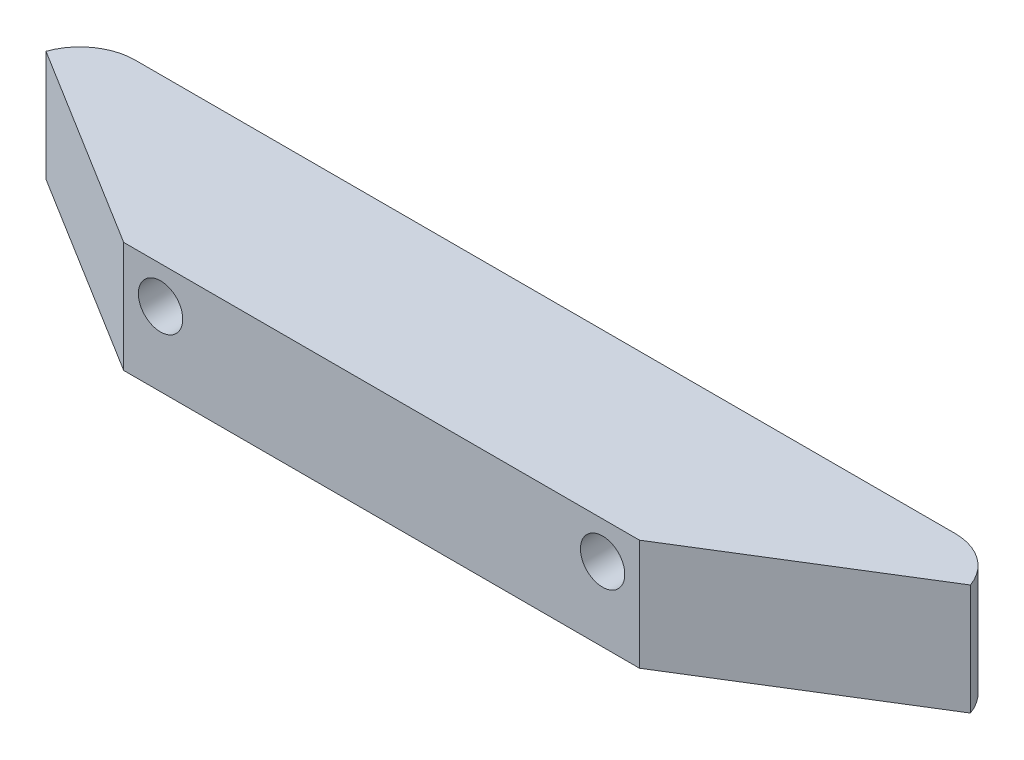
ISO-10303-21;
HEADER;
FILE_DESCRIPTION(('STEP AP214'),'2;1');
FILE_NAME('part.step','',(''),(''),'','','');
FILE_SCHEMA(('AUTOMOTIVE_DESIGN { 1 0 10303 214 1 1 1 1 }'));
ENDSEC;
DATA;
#1=APPLICATION_CONTEXT('core data for automotive mechanical design processes');
#2=APPLICATION_PROTOCOL_DEFINITION('international standard','automotive_design',2000,#1);
#3=PRODUCT_CONTEXT('',#1,'mechanical');
#4=PRODUCT('Part','Part','',(#3));
#5=PRODUCT_RELATED_PRODUCT_CATEGORY('part','',(#4));
#6=PRODUCT_DEFINITION_FORMATION('','',#4);
#7=PRODUCT_DEFINITION_CONTEXT('part definition',#1,'design');
#8=PRODUCT_DEFINITION('design','',#6,#7);
#9=PRODUCT_DEFINITION_SHAPE('','',#8);
#10=(LENGTH_UNIT() NAMED_UNIT(*) SI_UNIT(.MILLI.,.METRE.));
#11=(NAMED_UNIT(*) PLANE_ANGLE_UNIT() SI_UNIT($,.RADIAN.));
#12=(NAMED_UNIT(*) SI_UNIT($,.STERADIAN.) SOLID_ANGLE_UNIT());
#13=UNCERTAINTY_MEASURE_WITH_UNIT(LENGTH_MEASURE(1.E-05),#10,'distance_accuracy_value','');
#14=(GEOMETRIC_REPRESENTATION_CONTEXT(3) GLOBAL_UNCERTAINTY_ASSIGNED_CONTEXT((#13)) GLOBAL_UNIT_ASSIGNED_CONTEXT((#10,
#11,#12)) REPRESENTATION_CONTEXT('',''));
#15=CARTESIAN_POINT('',(0.,0.,0.));
#16=DIRECTION('',(0.,0.,1.));
#17=DIRECTION('',(1.,0.,0.));
#18=AXIS2_PLACEMENT_3D('',#15,#16,#17);
#19=CARTESIAN_POINT('',(-50.,12.,-13.7));
#20=DIRECTION('',(0.526798006466688,0.,-0.849990506054463));
#21=DIRECTION('',(-0.849990506054464,0.,-0.526798006466688));
#22=AXIS2_PLACEMENT_3D('',#19,#20,#21);
#23=PLANE('',#22);
#24=DIRECTION('',(0.849990506054463,0.,0.526798006466688));
#25=VECTOR('',#24,1.);
#26=CARTESIAN_POINT('',(-50.,0.,-13.7));
#27=LINE('',#26,#25);
#28=CARTESIAN_POINT('',(-50.,0.,-13.7));
#29=VERTEX_POINT('',#28);
#30=CARTESIAN_POINT('',(-27.895,0.,0.));
#31=VERTEX_POINT('',#30);
#32=EDGE_CURVE('E138',#29,#31,#27,.T.);
#33=ORIENTED_EDGE('',*,*,#32,.T.);
#34=DIRECTION('',(0.,-1.,0.));
#35=VECTOR('',#34,1.);
#36=CARTESIAN_POINT('',(-27.895,12.,0.));
#37=LINE('',#36,#35);
#38=CARTESIAN_POINT('',(-27.895,12.,0.));
#39=VERTEX_POINT('',#38);
#40=EDGE_CURVE('E95',#39,#31,#37,.T.);
#41=ORIENTED_EDGE('',*,*,#40,.F.);
#42=DIRECTION('',(0.849990506054463,0.,0.526798006466688));
#43=VECTOR('',#42,1.);
#44=CARTESIAN_POINT('',(-50.,12.,-13.7));
#45=LINE('',#44,#43);
#46=CARTESIAN_POINT('',(-50.,12.,-13.7));
#47=VERTEX_POINT('',#46);
#48=EDGE_CURVE('E85',#47,#39,#45,.T.);
#49=ORIENTED_EDGE('',*,*,#48,.F.);
#50=DIRECTION('',(0.,-1.,0.));
#51=VECTOR('',#50,1.);
#52=CARTESIAN_POINT('',(-50.,12.,-13.7));
#53=LINE('',#52,#51);
#54=EDGE_CURVE('E93',#47,#29,#53,.T.);
#55=ORIENTED_EDGE('',*,*,#54,.T.);
#56=EDGE_LOOP('',(#33,#41,#49,#55));
#57=FACE_BOUND('',#56,.T.);
#58=ADVANCED_FACE('F33',(#57),#23,.F.);
#59=CARTESIAN_POINT('',(-27.895,12.,0.));
#60=DIRECTION('',(0.,0.,-1.));
#61=DIRECTION('',(-1.,0.,0.));
#62=AXIS2_PLACEMENT_3D('',#59,#60,#61);
#63=PLANE('',#62);
#64=CARTESIAN_POINT('',(-23.91,7.99999999999999,0.));
#65=DIRECTION('',(0.,0.,1.));
#66=DIRECTION('',(1.,0.,0.));
#67=AXIS2_PLACEMENT_3D('',#64,#65,#66);
#68=CIRCLE('',#67,2.4);
#69=CARTESIAN_POINT('',(-21.51,7.99999999999999,0.));
#70=VERTEX_POINT('',#69);
#71=EDGE_CURVE('E149',#70,#70,#68,.T.);
#72=ORIENTED_EDGE('',*,*,#71,.F.);
#73=EDGE_LOOP('',(#72));
#74=FACE_BOUND('',#73,.T.);
#75=CARTESIAN_POINT('',(23.91,7.99999999999999,0.));
#76=DIRECTION('',(0.,0.,1.));
#77=DIRECTION('',(-1.,0.,0.));
#78=AXIS2_PLACEMENT_3D('',#75,#76,#77);
#79=CIRCLE('',#78,2.4);
#80=CARTESIAN_POINT('',(21.51,7.99999999999999,0.));
#81=VERTEX_POINT('',#80);
#82=EDGE_CURVE('E143',#81,#81,#79,.T.);
#83=ORIENTED_EDGE('',*,*,#82,.F.);
#84=EDGE_LOOP('',(#83));
#85=FACE_BOUND('',#84,.T.);
#86=DIRECTION('',(1.,0.,0.));
#87=VECTOR('',#86,1.);
#88=CARTESIAN_POINT('',(-27.895,0.,0.));
#89=LINE('',#88,#87);
#90=CARTESIAN_POINT('',(27.895,0.,0.));
#91=VERTEX_POINT('',#90);
#92=EDGE_CURVE('E129',#31,#91,#89,.T.);
#93=ORIENTED_EDGE('',*,*,#92,.T.);
#94=DIRECTION('',(0.,-1.,0.));
#95=VECTOR('',#94,1.);
#96=CARTESIAN_POINT('',(27.895,12.,0.));
#97=LINE('',#96,#95);
#98=CARTESIAN_POINT('',(27.895,12.,0.));
#99=VERTEX_POINT('',#98);
#100=EDGE_CURVE('E105',#99,#91,#97,.T.);
#101=ORIENTED_EDGE('',*,*,#100,.F.);
#102=DIRECTION('',(1.,0.,0.));
#103=VECTOR('',#102,1.);
#104=CARTESIAN_POINT('',(-27.895,12.,0.));
#105=LINE('',#104,#103);
#106=EDGE_CURVE('E97',#39,#99,#105,.T.);
#107=ORIENTED_EDGE('',*,*,#106,.F.);
#108=ORIENTED_EDGE('',*,*,#40,.T.);
#109=EDGE_LOOP('',(#93,#101,#107,#108));
#110=FACE_BOUND('',#109,.T.);
#111=ADVANCED_FACE('F164',(#74,#85,#110),#63,.F.);
#112=CARTESIAN_POINT('',(27.895,12.,0.));
#113=DIRECTION('',(-0.526798006466689,0.,-0.849990506054463));
#114=DIRECTION('',(-0.849990506054463,0.,0.526798006466689));
#115=AXIS2_PLACEMENT_3D('',#112,#113,#114);
#116=PLANE('',#115);
#117=DIRECTION('',(0.849990506054463,0.,-0.526798006466689));
#118=VECTOR('',#117,1.);
#119=CARTESIAN_POINT('',(27.895,0.,0.));
#120=LINE('',#119,#118);
#121=CARTESIAN_POINT('',(50.,0.,-13.7));
#122=VERTEX_POINT('',#121);
#123=EDGE_CURVE('E118',#91,#122,#120,.T.);
#124=ORIENTED_EDGE('',*,*,#123,.T.);
#125=DIRECTION('',(0.,-1.,0.));
#126=VECTOR('',#125,1.);
#127=CARTESIAN_POINT('',(50.,12.,-13.7));
#128=LINE('',#127,#126);
#129=CARTESIAN_POINT('',(50.,12.,-13.7));
#130=VERTEX_POINT('',#129);
#131=EDGE_CURVE('E127',#130,#122,#128,.T.);
#132=ORIENTED_EDGE('',*,*,#131,.F.);
#133=DIRECTION('',(0.849990506054463,0.,-0.526798006466689));
#134=VECTOR('',#133,1.);
#135=CARTESIAN_POINT('',(27.895,12.,0.));
#136=LINE('',#135,#134);
#137=EDGE_CURVE('E133',#99,#130,#136,.T.);
#138=ORIENTED_EDGE('',*,*,#137,.F.);
#139=ORIENTED_EDGE('',*,*,#100,.T.);
#140=EDGE_LOOP('',(#124,#132,#138,#139));
#141=FACE_BOUND('',#140,.T.);
#142=ADVANCED_FACE('F125',(#141),#116,.F.);
#143=CARTESIAN_POINT('',(-50.,12.,-17.7));
#144=DIRECTION('',(0.,0.,1.));
#145=DIRECTION('',(1.,0.,0.));
#146=AXIS2_PLACEMENT_3D('',#143,#144,#145);
#147=PLANE('',#146);
#148=DIRECTION('',(-1.,0.,0.));
#149=VECTOR('',#148,1.);
#150=CARTESIAN_POINT('',(-50.,12.,-17.7));
#151=LINE('',#150,#149);
#152=CARTESIAN_POINT('',(44.3431457505076,12.,-17.7));
#153=VERTEX_POINT('',#152);
#154=CARTESIAN_POINT('',(-44.3431457505076,12.,-17.7));
#155=VERTEX_POINT('',#154);
#156=EDGE_CURVE('E87',#153,#155,#151,.T.);
#157=ORIENTED_EDGE('',*,*,#156,.F.);
#158=DIRECTION('',(0.,-1.,0.));
#159=VECTOR('',#158,1.);
#160=CARTESIAN_POINT('',(44.3431457505076,12.,-17.7));
#161=LINE('',#160,#159);
#162=CARTESIAN_POINT('',(44.3431457505076,0.,-17.7));
#163=VERTEX_POINT('',#162);
#164=EDGE_CURVE('E103',#153,#163,#161,.T.);
#165=ORIENTED_EDGE('',*,*,#164,.T.);
#166=DIRECTION('',(-1.,0.,0.));
#167=VECTOR('',#166,1.);
#168=CARTESIAN_POINT('',(-50.,0.,-17.7));
#169=LINE('',#168,#167);
#170=CARTESIAN_POINT('',(-44.3431457505076,0.,-17.7));
#171=VERTEX_POINT('',#170);
#172=EDGE_CURVE('E98',#163,#171,#169,.T.);
#173=ORIENTED_EDGE('',*,*,#172,.T.);
#174=DIRECTION('',(0.,1.,0.));
#175=VECTOR('',#174,1.);
#176=CARTESIAN_POINT('',(-44.3431457505076,12.,-17.7));
#177=LINE('',#176,#175);
#178=EDGE_CURVE('E48',#171,#155,#177,.T.);
#179=ORIENTED_EDGE('',*,*,#178,.T.);
#180=EDGE_LOOP('',(#157,#165,#173,#179));
#181=FACE_BOUND('',#180,.T.);
#182=ADVANCED_FACE('F170',(#181),#147,.F.);
#183=CARTESIAN_POINT('',(0.,12.,0.));
#184=DIRECTION('',(0.,1.,0.));
#185=DIRECTION('',(0.,0.,1.));
#186=AXIS2_PLACEMENT_3D('',#183,#184,#185);
#187=PLANE('',#186);
#188=ORIENTED_EDGE('',*,*,#137,.T.);
#189=CARTESIAN_POINT('',(44.3431457505076,12.,-11.7));
#190=DIRECTION('',(0.,1.,0.));
#191=DIRECTION('',(0.,0.,1.));
#192=AXIS2_PLACEMENT_3D('',#189,#190,#191);
#193=CIRCLE('',#192,6.);
#194=EDGE_CURVE('E11',#130,#153,#193,.T.);
#195=ORIENTED_EDGE('',*,*,#194,.T.);
#196=ORIENTED_EDGE('',*,*,#156,.T.);
#197=CARTESIAN_POINT('',(-44.3431457505076,12.,-11.7));
#198=DIRECTION('',(0.,1.,0.));
#199=DIRECTION('',(0.,0.,1.));
#200=AXIS2_PLACEMENT_3D('',#197,#198,#199);
#201=CIRCLE('',#200,6.);
#202=EDGE_CURVE('E41',#155,#47,#201,.T.);
#203=ORIENTED_EDGE('',*,*,#202,.T.);
#204=ORIENTED_EDGE('',*,*,#48,.T.);
#205=ORIENTED_EDGE('',*,*,#106,.T.);
#206=EDGE_LOOP('',(#188,#195,#196,#203,#204,#205));
#207=FACE_BOUND('',#206,.T.);
#208=ADVANCED_FACE('F84',(#207),#187,.T.);
#209=CARTESIAN_POINT('',(0.,0.,0.));
#210=DIRECTION('',(0.,1.,0.));
#211=DIRECTION('',(0.,0.,1.));
#212=AXIS2_PLACEMENT_3D('',#209,#210,#211);
#213=PLANE('',#212);
#214=ORIENTED_EDGE('',*,*,#172,.F.);
#215=CARTESIAN_POINT('',(44.3431457505076,0.,-11.7));
#216=DIRECTION('',(0.,1.,0.));
#217=DIRECTION('',(0.,0.,1.));
#218=AXIS2_PLACEMENT_3D('',#215,#216,#217);
#219=CIRCLE('',#218,6.);
#220=EDGE_CURVE('E90',#163,#122,#219,.F.);
#221=ORIENTED_EDGE('',*,*,#220,.T.);
#222=ORIENTED_EDGE('',*,*,#123,.F.);
#223=ORIENTED_EDGE('',*,*,#92,.F.);
#224=ORIENTED_EDGE('',*,*,#32,.F.);
#225=CARTESIAN_POINT('',(-44.3431457505076,0.,-11.7));
#226=DIRECTION('',(0.,1.,0.));
#227=DIRECTION('',(0.,0.,1.));
#228=AXIS2_PLACEMENT_3D('',#225,#226,#227);
#229=CIRCLE('',#228,6.);
#230=EDGE_CURVE('E100',#29,#171,#229,.F.);
#231=ORIENTED_EDGE('',*,*,#230,.T.);
#232=EDGE_LOOP('',(#214,#221,#222,#223,#224,#231));
#233=FACE_BOUND('',#232,.T.);
#234=ADVANCED_FACE('F116',(#233),#213,.F.);
#235=CARTESIAN_POINT('',(23.91,7.99999999999999,-8.5));
#236=DIRECTION('',(0.,0.,1.));
#237=DIRECTION('',(1.,0.,0.));
#238=AXIS2_PLACEMENT_3D('',#235,#236,#237);
#239=CYLINDRICAL_SURFACE('',#238,2.4);
#240=CARTESIAN_POINT('',(23.91,7.99999999999999,-8.5));
#241=DIRECTION('',(0.,0.,1.));
#242=DIRECTION('',(-1.,0.,0.));
#243=AXIS2_PLACEMENT_3D('',#240,#241,#242);
#244=CIRCLE('',#243,2.4);
#245=CARTESIAN_POINT('',(21.51,7.99999999999999,-8.5));
#246=VERTEX_POINT('',#245);
#247=EDGE_CURVE('E146',#246,#246,#244,.T.);
#248=ORIENTED_EDGE('',*,*,#247,.F.);
#249=EDGE_LOOP('',(#248));
#250=FACE_BOUND('',#249,.T.);
#251=ORIENTED_EDGE('',*,*,#82,.T.);
#252=EDGE_LOOP('',(#251));
#253=FACE_BOUND('',#252,.T.);
#254=ADVANCED_FACE('F195',(#250,#253),#239,.F.);
#255=CARTESIAN_POINT('',(23.91,7.99999999999999,-8.5));
#256=DIRECTION('',(0.,0.,-1.));
#257=DIRECTION('',(-1.,0.,0.));
#258=AXIS2_PLACEMENT_3D('',#255,#256,#257);
#259=PLANE('',#258);
#260=ORIENTED_EDGE('',*,*,#247,.T.);
#261=EDGE_LOOP('',(#260));
#262=FACE_BOUND('',#261,.T.);
#263=ADVANCED_FACE('F160',(#262),#259,.F.);
#264=CARTESIAN_POINT('',(-23.91,7.99999999999999,-8.5));
#265=DIRECTION('',(0.,0.,1.));
#266=DIRECTION('',(1.,0.,0.));
#267=AXIS2_PLACEMENT_3D('',#264,#265,#266);
#268=CYLINDRICAL_SURFACE('',#267,2.4);
#269=CARTESIAN_POINT('',(-23.91,7.99999999999999,-8.5));
#270=DIRECTION('',(0.,0.,1.));
#271=DIRECTION('',(1.,0.,0.));
#272=AXIS2_PLACEMENT_3D('',#269,#270,#271);
#273=CIRCLE('',#272,2.4);
#274=CARTESIAN_POINT('',(-21.51,7.99999999999999,-8.5));
#275=VERTEX_POINT('',#274);
#276=EDGE_CURVE('E139',#275,#275,#273,.T.);
#277=ORIENTED_EDGE('',*,*,#276,.F.);
#278=EDGE_LOOP('',(#277));
#279=FACE_BOUND('',#278,.T.);
#280=ORIENTED_EDGE('',*,*,#71,.T.);
#281=EDGE_LOOP('',(#280));
#282=FACE_BOUND('',#281,.T.);
#283=ADVANCED_FACE('F157',(#279,#282),#268,.F.);
#284=CARTESIAN_POINT('',(-23.91,7.99999999999999,-8.5));
#285=DIRECTION('',(0.,0.,1.));
#286=DIRECTION('',(1.,0.,0.));
#287=AXIS2_PLACEMENT_3D('',#284,#285,#286);
#288=PLANE('',#287);
#289=ORIENTED_EDGE('',*,*,#276,.T.);
#290=EDGE_LOOP('',(#289));
#291=FACE_BOUND('',#290,.T.);
#292=ADVANCED_FACE('F155',(#291),#288,.T.);
#293=CARTESIAN_POINT('',(44.3431457505076,12.,-11.7));
#294=DIRECTION('',(0.,-1.,0.));
#295=DIRECTION('',(0.,0.,-1.));
#296=AXIS2_PLACEMENT_3D('',#293,#294,#295);
#297=CYLINDRICAL_SURFACE('',#296,6.);
#298=ORIENTED_EDGE('',*,*,#194,.F.);
#299=ORIENTED_EDGE('',*,*,#131,.T.);
#300=ORIENTED_EDGE('',*,*,#220,.F.);
#301=ORIENTED_EDGE('',*,*,#164,.F.);
#302=EDGE_LOOP('',(#298,#299,#300,#301));
#303=FACE_BOUND('',#302,.T.);
#304=ADVANCED_FACE('F131',(#303),#297,.T.);
#305=CARTESIAN_POINT('',(-44.3431457505076,12.,-11.7));
#306=DIRECTION('',(0.,1.,0.));
#307=DIRECTION('',(0.,0.,1.));
#308=AXIS2_PLACEMENT_3D('',#305,#306,#307);
#309=CYLINDRICAL_SURFACE('',#308,6.);
#310=ORIENTED_EDGE('',*,*,#202,.F.);
#311=ORIENTED_EDGE('',*,*,#178,.F.);
#312=ORIENTED_EDGE('',*,*,#230,.F.);
#313=ORIENTED_EDGE('',*,*,#54,.F.);
#314=EDGE_LOOP('',(#310,#311,#312,#313));
#315=FACE_BOUND('',#314,.T.);
#316=ADVANCED_FACE('F35',(#315),#309,.T.);
#317=CLOSED_SHELL('',(#58,#111,#142,#182,#208,#234,#254,#263,#283,#292,#304,#316));
#318=MANIFOLD_SOLID_BREP('B2',#317);
#319=ADVANCED_BREP_SHAPE_REPRESENTATION('',(#18,#318),#14);
#320=SHAPE_DEFINITION_REPRESENTATION(#9,#319);
ENDSEC;
END-ISO-10303-21;
